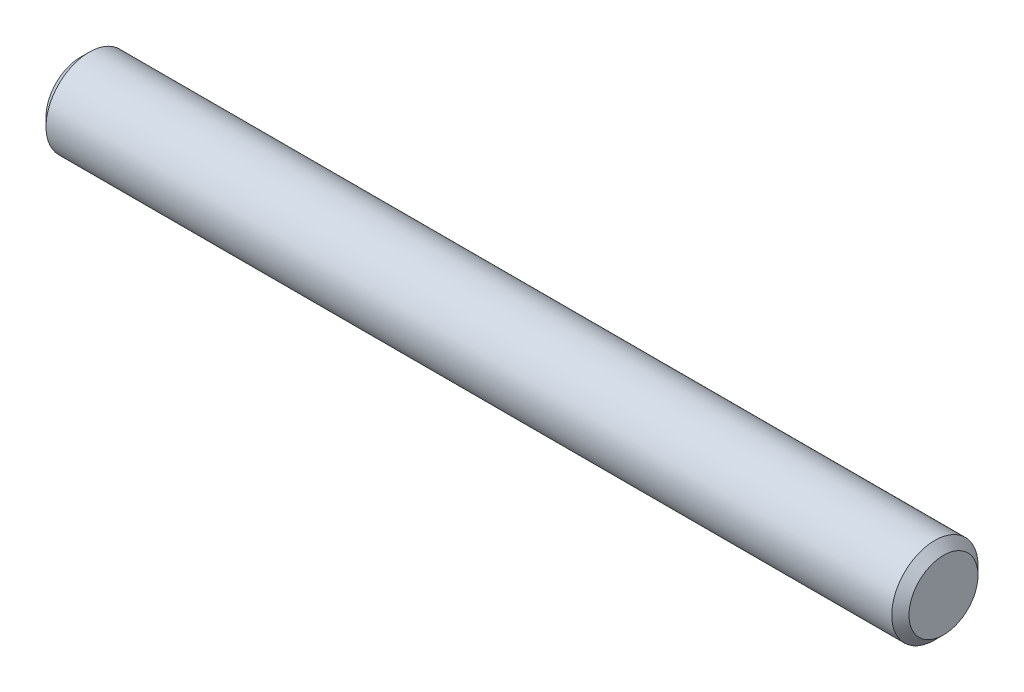
ISO-10303-21;
HEADER;
FILE_DESCRIPTION(('STEP AP214'),'2;1');
FILE_NAME('part.step','',(''),(''),'','','');
FILE_SCHEMA(('AUTOMOTIVE_DESIGN { 1 0 10303 214 1 1 1 1 }'));
ENDSEC;
DATA;
#1=APPLICATION_CONTEXT('core data for automotive mechanical design processes');
#2=APPLICATION_PROTOCOL_DEFINITION('international standard','automotive_design',2000,#1);
#3=PRODUCT_CONTEXT('',#1,'mechanical');
#4=PRODUCT('Part','Part','',(#3));
#5=PRODUCT_RELATED_PRODUCT_CATEGORY('part','',(#4));
#6=PRODUCT_DEFINITION_FORMATION('','',#4);
#7=PRODUCT_DEFINITION_CONTEXT('part definition',#1,'design');
#8=PRODUCT_DEFINITION('design','',#6,#7);
#9=PRODUCT_DEFINITION_SHAPE('','',#8);
#10=(LENGTH_UNIT() NAMED_UNIT(*) SI_UNIT(.MILLI.,.METRE.));
#11=(NAMED_UNIT(*) PLANE_ANGLE_UNIT() SI_UNIT($,.RADIAN.));
#12=(NAMED_UNIT(*) SI_UNIT($,.STERADIAN.) SOLID_ANGLE_UNIT());
#13=UNCERTAINTY_MEASURE_WITH_UNIT(LENGTH_MEASURE(1.E-05),#10,'distance_accuracy_value','');
#14=(GEOMETRIC_REPRESENTATION_CONTEXT(3) GLOBAL_UNCERTAINTY_ASSIGNED_CONTEXT((#13)) GLOBAL_UNIT_ASSIGNED_CONTEXT((#10,
#11,#12)) REPRESENTATION_CONTEXT('',''));
#15=CARTESIAN_POINT('',(0.,0.,0.));
#16=DIRECTION('',(0.,0.,1.));
#17=DIRECTION('',(1.,0.,0.));
#18=AXIS2_PLACEMENT_3D('',#15,#16,#17);
#19=CARTESIAN_POINT('',(-3.96875,0.,0.));
#20=DIRECTION('',(1.,0.,0.));
#21=DIRECTION('',(0.,0.,-1.));
#22=AXIS2_PLACEMENT_3D('',#19,#20,#21);
#23=CYLINDRICAL_SURFACE('',#22,0.396875);
#24=CARTESIAN_POINT('',(3.889375,0.,0.));
#25=DIRECTION('',(1.,0.,0.));
#26=DIRECTION('',(0.,0.,-1.));
#27=AXIS2_PLACEMENT_3D('',#24,#25,#26);
#28=CIRCLE('',#27,0.396875);
#29=CARTESIAN_POINT('',(3.889375,0.,-0.396875));
#30=VERTEX_POINT('',#29);
#31=EDGE_CURVE('E37',#30,#30,#28,.F.);
#32=ORIENTED_EDGE('',*,*,#31,.T.);
#33=EDGE_LOOP('',(#32));
#34=FACE_BOUND('',#33,.T.);
#35=CARTESIAN_POINT('',(-3.889375,0.,0.));
#36=DIRECTION('',(1.,0.,0.));
#37=DIRECTION('',(0.,0.,-1.));
#38=AXIS2_PLACEMENT_3D('',#35,#36,#37);
#39=CIRCLE('',#38,0.396875);
#40=CARTESIAN_POINT('',(-3.889375,0.,-0.396875));
#41=VERTEX_POINT('',#40);
#42=EDGE_CURVE('E41',#41,#41,#39,.T.);
#43=ORIENTED_EDGE('',*,*,#42,.T.);
#44=EDGE_LOOP('',(#43));
#45=FACE_BOUND('',#44,.T.);
#46=ADVANCED_FACE('F30',(#34,#45),#23,.T.);
#47=CARTESIAN_POINT('',(-3.96875,0.,0.));
#48=DIRECTION('',(1.,0.,0.));
#49=DIRECTION('',(0.,0.,-1.));
#50=AXIS2_PLACEMENT_3D('',#47,#48,#49);
#51=PLANE('',#50);
#52=CARTESIAN_POINT('',(-3.96875,0.,0.));
#53=DIRECTION('',(1.,0.,0.));
#54=DIRECTION('',(0.,0.,-1.));
#55=AXIS2_PLACEMENT_3D('',#52,#53,#54);
#56=CIRCLE('',#55,0.3175);
#57=CARTESIAN_POINT('',(-3.96875,0.,-0.3175));
#58=VERTEX_POINT('',#57);
#59=EDGE_CURVE('E10',#58,#58,#56,.F.);
#60=ORIENTED_EDGE('',*,*,#59,.T.);
#61=EDGE_LOOP('',(#60));
#62=FACE_BOUND('',#61,.T.);
#63=ADVANCED_FACE('F61',(#62),#51,.F.);
#64=CARTESIAN_POINT('',(3.96875,0.,0.));
#65=DIRECTION('',(1.,0.,0.));
#66=DIRECTION('',(0.,0.,-1.));
#67=AXIS2_PLACEMENT_3D('',#64,#65,#66);
#68=PLANE('',#67);
#69=CARTESIAN_POINT('',(3.96875,0.,0.));
#70=DIRECTION('',(1.,0.,0.));
#71=DIRECTION('',(0.,0.,-1.));
#72=AXIS2_PLACEMENT_3D('',#69,#70,#71);
#73=CIRCLE('',#72,0.3175);
#74=CARTESIAN_POINT('',(3.96875,0.,-0.3175));
#75=VERTEX_POINT('',#74);
#76=EDGE_CURVE('E45',#75,#75,#73,.T.);
#77=ORIENTED_EDGE('',*,*,#76,.T.);
#78=EDGE_LOOP('',(#77));
#79=FACE_BOUND('',#78,.T.);
#80=ADVANCED_FACE('F51',(#79),#68,.T.);
#81=CARTESIAN_POINT('',(3.96875,0.,0.));
#82=DIRECTION('',(-1.,0.,0.));
#83=DIRECTION('',(0.,0.,1.));
#84=AXIS2_PLACEMENT_3D('',#81,#82,#83);
#85=CONICAL_SURFACE('',#84,0.317499999999999,0.785398163397434);
#86=ORIENTED_EDGE('',*,*,#31,.F.);
#87=EDGE_LOOP('',(#86));
#88=FACE_BOUND('',#87,.T.);
#89=ORIENTED_EDGE('',*,*,#76,.F.);
#90=EDGE_LOOP('',(#89));
#91=FACE_BOUND('',#90,.T.);
#92=ADVANCED_FACE('F53',(#88,#91),#85,.T.);
#93=CARTESIAN_POINT('',(-3.889375,0.,0.));
#94=DIRECTION('',(1.,0.,0.));
#95=DIRECTION('',(0.,0.,-1.));
#96=AXIS2_PLACEMENT_3D('',#93,#94,#95);
#97=CONICAL_SURFACE('',#96,0.396875,0.78539816339745);
#98=ORIENTED_EDGE('',*,*,#59,.F.);
#99=EDGE_LOOP('',(#98));
#100=FACE_BOUND('',#99,.T.);
#101=ORIENTED_EDGE('',*,*,#42,.F.);
#102=EDGE_LOOP('',(#101));
#103=FACE_BOUND('',#102,.T.);
#104=ADVANCED_FACE('F32',(#100,#103),#97,.T.);
#105=CLOSED_SHELL('',(#46,#63,#80,#92,#104));
#106=MANIFOLD_SOLID_BREP('B2',#105);
#107=ADVANCED_BREP_SHAPE_REPRESENTATION('',(#18,#106),#14);
#108=SHAPE_DEFINITION_REPRESENTATION(#9,#107);
ENDSEC;
END-ISO-10303-21;
